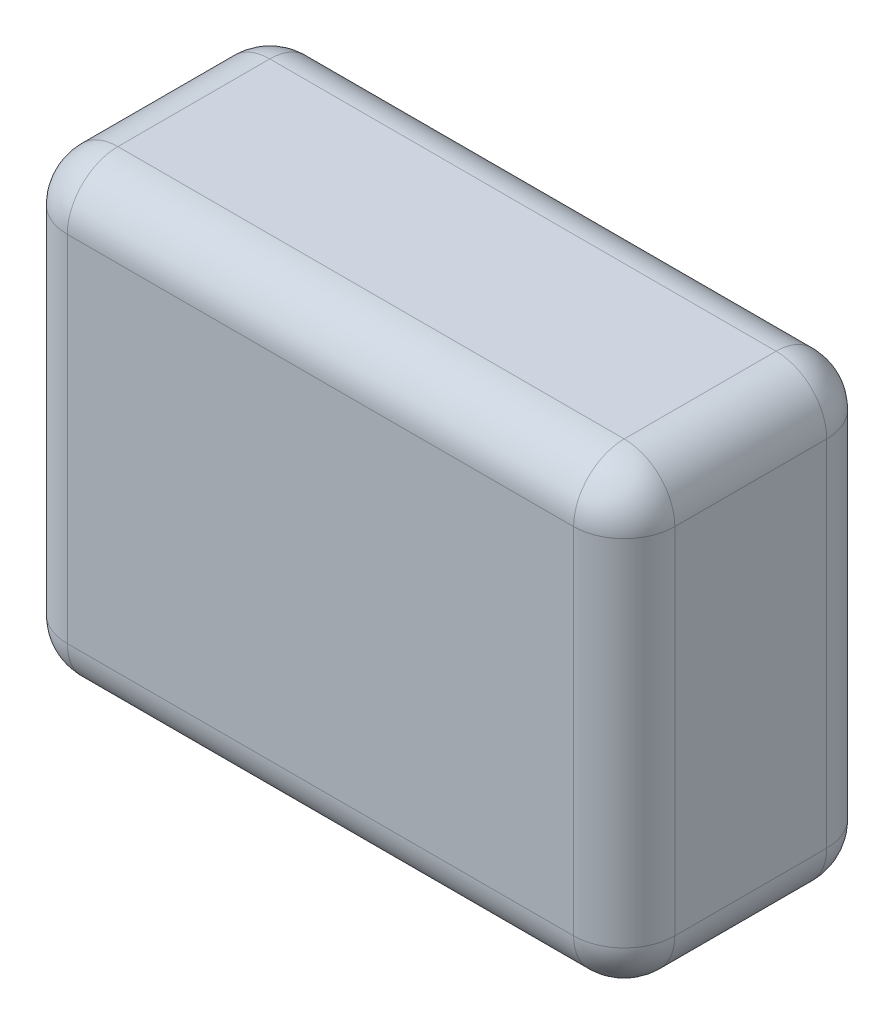
ISO-10303-21;
HEADER;
FILE_DESCRIPTION(('STEP AP214'),'2;1');
FILE_NAME('part.step','',(''),(''),'','','');
FILE_SCHEMA(('AUTOMOTIVE_DESIGN { 1 0 10303 214 1 1 1 1 }'));
ENDSEC;
DATA;
#1=APPLICATION_CONTEXT('core data for automotive mechanical design processes');
#2=APPLICATION_PROTOCOL_DEFINITION('international standard','automotive_design',2000,#1);
#3=PRODUCT_CONTEXT('',#1,'mechanical');
#4=PRODUCT('Part','Part','',(#3));
#5=PRODUCT_RELATED_PRODUCT_CATEGORY('part','',(#4));
#6=PRODUCT_DEFINITION_FORMATION('','',#4);
#7=PRODUCT_DEFINITION_CONTEXT('part definition',#1,'design');
#8=PRODUCT_DEFINITION('design','',#6,#7);
#9=PRODUCT_DEFINITION_SHAPE('','',#8);
#10=(LENGTH_UNIT() NAMED_UNIT(*) SI_UNIT(.MILLI.,.METRE.));
#11=(NAMED_UNIT(*) PLANE_ANGLE_UNIT() SI_UNIT($,.RADIAN.));
#12=(NAMED_UNIT(*) SI_UNIT($,.STERADIAN.) SOLID_ANGLE_UNIT());
#13=UNCERTAINTY_MEASURE_WITH_UNIT(LENGTH_MEASURE(1.E-05),#10,'distance_accuracy_value','');
#14=(GEOMETRIC_REPRESENTATION_CONTEXT(3) GLOBAL_UNCERTAINTY_ASSIGNED_CONTEXT((#13)) GLOBAL_UNIT_ASSIGNED_CONTEXT((#10,
#11,#12)) REPRESENTATION_CONTEXT('',''));
#15=CARTESIAN_POINT('',(0.,0.,0.));
#16=DIRECTION('',(0.,0.,1.));
#17=DIRECTION('',(1.,0.,0.));
#18=AXIS2_PLACEMENT_3D('',#15,#16,#17);
#19=CARTESIAN_POINT('',(60.,45.,50.));
#20=DIRECTION('',(-1.,0.,0.));
#21=DIRECTION('',(0.,-1.,0.));
#22=AXIS2_PLACEMENT_3D('',#19,#20,#21);
#23=PLANE('',#22);
#24=DIRECTION('',(0.,0.,-1.));
#25=VECTOR('',#24,1.);
#26=CARTESIAN_POINT('',(60.,35.,50.));
#27=LINE('',#26,#25);
#28=CARTESIAN_POINT('',(60.,35.,10.));
#29=VERTEX_POINT('',#28);
#30=CARTESIAN_POINT('',(60.,35.,40.));
#31=VERTEX_POINT('',#30);
#32=EDGE_CURVE('E129',#29,#31,#27,.F.);
#33=ORIENTED_EDGE('',*,*,#32,.T.);
#34=DIRECTION('',(0.,1.,0.));
#35=VECTOR('',#34,1.);
#36=CARTESIAN_POINT('',(60.,-45.,40.));
#37=LINE('',#36,#35);
#38=CARTESIAN_POINT('',(60.,-35.,40.));
#39=VERTEX_POINT('',#38);
#40=EDGE_CURVE('E166',#31,#39,#37,.F.);
#41=ORIENTED_EDGE('',*,*,#40,.T.);
#42=DIRECTION('',(0.,0.,-1.));
#43=VECTOR('',#42,1.);
#44=CARTESIAN_POINT('',(60.,-35.,50.));
#45=LINE('',#44,#43);
#46=CARTESIAN_POINT('',(60.,-35.,10.));
#47=VERTEX_POINT('',#46);
#48=EDGE_CURVE('E163',#39,#47,#45,.T.);
#49=ORIENTED_EDGE('',*,*,#48,.T.);
#50=DIRECTION('',(0.,1.,0.));
#51=VECTOR('',#50,1.);
#52=CARTESIAN_POINT('',(60.,45.,10.));
#53=LINE('',#52,#51);
#54=EDGE_CURVE('E158',#47,#29,#53,.T.);
#55=ORIENTED_EDGE('',*,*,#54,.T.);
#56=EDGE_LOOP('',(#33,#41,#49,#55));
#57=FACE_BOUND('',#56,.T.);
#58=ADVANCED_FACE('F33',(#57),#23,.F.);
#59=CARTESIAN_POINT('',(-60.,45.,50.));
#60=DIRECTION('',(0.,-1.,0.));
#61=DIRECTION('',(0.,0.,-1.));
#62=AXIS2_PLACEMENT_3D('',#59,#60,#61);
#63=PLANE('',#62);
#64=DIRECTION('',(0.,0.,-1.));
#65=VECTOR('',#64,1.);
#66=CARTESIAN_POINT('',(-50.,45.,50.));
#67=LINE('',#66,#65);
#68=CARTESIAN_POINT('',(-50.,45.,10.));
#69=VERTEX_POINT('',#68);
#70=CARTESIAN_POINT('',(-50.,45.,40.));
#71=VERTEX_POINT('',#70);
#72=EDGE_CURVE('E151',#69,#71,#67,.F.);
#73=ORIENTED_EDGE('',*,*,#72,.T.);
#74=DIRECTION('',(-1.,0.,0.));
#75=VECTOR('',#74,1.);
#76=CARTESIAN_POINT('',(60.,45.,40.));
#77=LINE('',#76,#75);
#78=CARTESIAN_POINT('',(50.,45.,40.));
#79=VERTEX_POINT('',#78);
#80=EDGE_CURVE('E155',#71,#79,#77,.F.);
#81=ORIENTED_EDGE('',*,*,#80,.T.);
#82=DIRECTION('',(0.,0.,-1.));
#83=VECTOR('',#82,1.);
#84=CARTESIAN_POINT('',(50.,45.,50.));
#85=LINE('',#84,#83);
#86=CARTESIAN_POINT('',(50.,45.,10.));
#87=VERTEX_POINT('',#86);
#88=EDGE_CURVE('E127',#79,#87,#85,.T.);
#89=ORIENTED_EDGE('',*,*,#88,.T.);
#90=DIRECTION('',(-1.,0.,0.));
#91=VECTOR('',#90,1.);
#92=CARTESIAN_POINT('',(-60.,45.,10.));
#93=LINE('',#92,#91);
#94=EDGE_CURVE('E145',#87,#69,#93,.T.);
#95=ORIENTED_EDGE('',*,*,#94,.T.);
#96=EDGE_LOOP('',(#73,#81,#89,#95));
#97=FACE_BOUND('',#96,.T.);
#98=ADVANCED_FACE('F153',(#97),#63,.F.);
#99=CARTESIAN_POINT('',(-60.,45.,50.));
#100=DIRECTION('',(1.,0.,0.));
#101=DIRECTION('',(0.,1.,0.));
#102=AXIS2_PLACEMENT_3D('',#99,#100,#101);
#103=PLANE('',#102);
#104=DIRECTION('',(0.,0.,-1.));
#105=VECTOR('',#104,1.);
#106=CARTESIAN_POINT('',(-60.,-35.,50.));
#107=LINE('',#106,#105);
#108=CARTESIAN_POINT('',(-60.,-35.,10.));
#109=VERTEX_POINT('',#108);
#110=CARTESIAN_POINT('',(-60.,-35.,40.));
#111=VERTEX_POINT('',#110);
#112=EDGE_CURVE('E170',#109,#111,#107,.F.);
#113=ORIENTED_EDGE('',*,*,#112,.T.);
#114=DIRECTION('',(0.,-1.,0.));
#115=VECTOR('',#114,1.);
#116=CARTESIAN_POINT('',(-60.,45.,40.));
#117=LINE('',#116,#115);
#118=CARTESIAN_POINT('',(-60.,35.,40.));
#119=VERTEX_POINT('',#118);
#120=EDGE_CURVE('E175',#111,#119,#117,.F.);
#121=ORIENTED_EDGE('',*,*,#120,.T.);
#122=DIRECTION('',(0.,0.,-1.));
#123=VECTOR('',#122,1.);
#124=CARTESIAN_POINT('',(-60.,35.,50.));
#125=LINE('',#124,#123);
#126=CARTESIAN_POINT('',(-60.,35.,10.));
#127=VERTEX_POINT('',#126);
#128=EDGE_CURVE('E172',#119,#127,#125,.T.);
#129=ORIENTED_EDGE('',*,*,#128,.T.);
#130=DIRECTION('',(0.,-1.,0.));
#131=VECTOR('',#130,1.);
#132=CARTESIAN_POINT('',(-60.,45.,10.));
#133=LINE('',#132,#131);
#134=EDGE_CURVE('E168',#127,#109,#133,.T.);
#135=ORIENTED_EDGE('',*,*,#134,.T.);
#136=EDGE_LOOP('',(#113,#121,#129,#135));
#137=FACE_BOUND('',#136,.T.);
#138=ADVANCED_FACE('F280',(#137),#103,.F.);
#139=CARTESIAN_POINT('',(-60.,-45.,50.));
#140=DIRECTION('',(0.,1.,0.));
#141=DIRECTION('',(0.,0.,1.));
#142=AXIS2_PLACEMENT_3D('',#139,#140,#141);
#143=PLANE('',#142);
#144=DIRECTION('',(0.,0.,-1.));
#145=VECTOR('',#144,1.);
#146=CARTESIAN_POINT('',(50.,-45.,50.));
#147=LINE('',#146,#145);
#148=CARTESIAN_POINT('',(50.,-45.,10.));
#149=VERTEX_POINT('',#148);
#150=CARTESIAN_POINT('',(50.,-45.,40.));
#151=VERTEX_POINT('',#150);
#152=EDGE_CURVE('E179',#149,#151,#147,.F.);
#153=ORIENTED_EDGE('',*,*,#152,.T.);
#154=DIRECTION('',(1.,0.,0.));
#155=VECTOR('',#154,1.);
#156=CARTESIAN_POINT('',(-60.,-45.,40.));
#157=LINE('',#156,#155);
#158=CARTESIAN_POINT('',(-50.,-45.,40.));
#159=VERTEX_POINT('',#158);
#160=EDGE_CURVE('E184',#151,#159,#157,.F.);
#161=ORIENTED_EDGE('',*,*,#160,.T.);
#162=DIRECTION('',(0.,0.,-1.));
#163=VECTOR('',#162,1.);
#164=CARTESIAN_POINT('',(-50.,-45.,50.));
#165=LINE('',#164,#163);
#166=CARTESIAN_POINT('',(-50.,-45.,10.));
#167=VERTEX_POINT('',#166);
#168=EDGE_CURVE('E181',#159,#167,#165,.T.);
#169=ORIENTED_EDGE('',*,*,#168,.T.);
#170=DIRECTION('',(1.,0.,0.));
#171=VECTOR('',#170,1.);
#172=CARTESIAN_POINT('',(-60.,-45.,10.));
#173=LINE('',#172,#171);
#174=EDGE_CURVE('E177',#167,#149,#173,.T.);
#175=ORIENTED_EDGE('',*,*,#174,.T.);
#176=EDGE_LOOP('',(#153,#161,#169,#175));
#177=FACE_BOUND('',#176,.T.);
#178=ADVANCED_FACE('F291',(#177),#143,.F.);
#179=CARTESIAN_POINT('',(60.,-45.,50.));
#180=DIRECTION('',(0.,0.,1.));
#181=DIRECTION('',(1.,0.,0.));
#182=AXIS2_PLACEMENT_3D('',#179,#180,#181);
#183=PLANE('',#182);
#184=DIRECTION('',(0.,-1.,0.));
#185=VECTOR('',#184,1.);
#186=CARTESIAN_POINT('',(-50.,-45.,50.));
#187=LINE('',#186,#185);
#188=CARTESIAN_POINT('',(-50.,35.,50.));
#189=VERTEX_POINT('',#188);
#190=CARTESIAN_POINT('',(-50.,-35.,50.));
#191=VERTEX_POINT('',#190);
#192=EDGE_CURVE('E190',#189,#191,#187,.T.);
#193=ORIENTED_EDGE('',*,*,#192,.T.);
#194=DIRECTION('',(1.,0.,0.));
#195=VECTOR('',#194,1.);
#196=CARTESIAN_POINT('',(60.,-35.,50.));
#197=LINE('',#196,#195);
#198=CARTESIAN_POINT('',(50.,-35.,50.));
#199=VERTEX_POINT('',#198);
#200=EDGE_CURVE('E192',#191,#199,#197,.T.);
#201=ORIENTED_EDGE('',*,*,#200,.T.);
#202=DIRECTION('',(0.,1.,0.));
#203=VECTOR('',#202,1.);
#204=CARTESIAN_POINT('',(50.,45.,50.));
#205=LINE('',#204,#203);
#206=CARTESIAN_POINT('',(50.,35.,50.));
#207=VERTEX_POINT('',#206);
#208=EDGE_CURVE('E186',#199,#207,#205,.T.);
#209=ORIENTED_EDGE('',*,*,#208,.T.);
#210=DIRECTION('',(-1.,0.,0.));
#211=VECTOR('',#210,1.);
#212=CARTESIAN_POINT('',(-60.,35.,50.));
#213=LINE('',#212,#211);
#214=EDGE_CURVE('E188',#207,#189,#213,.T.);
#215=ORIENTED_EDGE('',*,*,#214,.T.);
#216=EDGE_LOOP('',(#193,#201,#209,#215));
#217=FACE_BOUND('',#216,.T.);
#218=ADVANCED_FACE('F272',(#217),#183,.T.);
#219=CARTESIAN_POINT('',(60.,-45.,0.));
#220=DIRECTION('',(0.,0.,1.));
#221=DIRECTION('',(1.,0.,0.));
#222=AXIS2_PLACEMENT_3D('',#219,#220,#221);
#223=PLANE('',#222);
#224=DIRECTION('',(0.,-1.,0.));
#225=VECTOR('',#224,1.);
#226=CARTESIAN_POINT('',(-50.,-45.,0.));
#227=LINE('',#226,#225);
#228=CARTESIAN_POINT('',(-50.,-35.,0.));
#229=VERTEX_POINT('',#228);
#230=CARTESIAN_POINT('',(-50.,35.,0.));
#231=VERTEX_POINT('',#230);
#232=EDGE_CURVE('E42',#229,#231,#227,.F.);
#233=ORIENTED_EDGE('',*,*,#232,.T.);
#234=DIRECTION('',(-1.,0.,0.));
#235=VECTOR('',#234,1.);
#236=CARTESIAN_POINT('',(60.,35.,0.));
#237=LINE('',#236,#235);
#238=CARTESIAN_POINT('',(50.,35.,0.));
#239=VERTEX_POINT('',#238);
#240=EDGE_CURVE('E11',#231,#239,#237,.F.);
#241=ORIENTED_EDGE('',*,*,#240,.T.);
#242=DIRECTION('',(0.,1.,0.));
#243=VECTOR('',#242,1.);
#244=CARTESIAN_POINT('',(50.,-45.,0.));
#245=LINE('',#244,#243);
#246=CARTESIAN_POINT('',(50.,-35.,0.));
#247=VERTEX_POINT('',#246);
#248=EDGE_CURVE('E195',#239,#247,#245,.F.);
#249=ORIENTED_EDGE('',*,*,#248,.T.);
#250=DIRECTION('',(1.,0.,0.));
#251=VECTOR('',#250,1.);
#252=CARTESIAN_POINT('',(60.,-35.,0.));
#253=LINE('',#252,#251);
#254=EDGE_CURVE('E53',#247,#229,#253,.F.);
#255=ORIENTED_EDGE('',*,*,#254,.T.);
#256=EDGE_LOOP('',(#233,#241,#249,#255));
#257=FACE_BOUND('',#256,.T.);
#258=ADVANCED_FACE('F478',(#257),#223,.F.);
#259=CARTESIAN_POINT('',(-50.,-35.,50.));
#260=DIRECTION('',(0.,0.,-1.));
#261=DIRECTION('',(-1.,0.,0.));
#262=AXIS2_PLACEMENT_3D('',#259,#260,#261);
#263=CYLINDRICAL_SURFACE('',#262,10.);
#264=CARTESIAN_POINT('',(-50.,-35.,40.));
#265=DIRECTION('',(0.,0.,1.));
#266=DIRECTION('',(1.,0.,0.));
#267=AXIS2_PLACEMENT_3D('',#264,#265,#266);
#268=CIRCLE('',#267,10.);
#269=EDGE_CURVE('E37',#111,#159,#268,.T.);
#270=ORIENTED_EDGE('',*,*,#269,.F.);
#271=ORIENTED_EDGE('',*,*,#112,.F.);
#272=CARTESIAN_POINT('',(-50.,-35.,10.));
#273=DIRECTION('',(0.,0.,-1.));
#274=DIRECTION('',(-1.,0.,0.));
#275=AXIS2_PLACEMENT_3D('',#272,#273,#274);
#276=CIRCLE('',#275,10.);
#277=EDGE_CURVE('E249',#167,#109,#276,.T.);
#278=ORIENTED_EDGE('',*,*,#277,.F.);
#279=ORIENTED_EDGE('',*,*,#168,.F.);
#280=EDGE_LOOP('',(#270,#271,#278,#279));
#281=FACE_BOUND('',#280,.T.);
#282=ADVANCED_FACE('F35',(#281),#263,.T.);
#283=CARTESIAN_POINT('',(-50.,-35.,40.));
#284=DIRECTION('',(0.,0.,1.));
#285=DIRECTION('',(1.,0.,0.));
#286=AXIS2_PLACEMENT_3D('',#283,#284,#285);
#287=SPHERICAL_SURFACE('',#286,10.);
#288=CARTESIAN_POINT('',(-50.,-35.,40.));
#289=DIRECTION('',(0.,-1.,0.));
#290=DIRECTION('',(0.,0.,-1.));
#291=AXIS2_PLACEMENT_3D('',#288,#289,#290);
#292=CIRCLE('',#291,10.);
#293=EDGE_CURVE('E244',#111,#191,#292,.F.);
#294=ORIENTED_EDGE('',*,*,#293,.F.);
#295=ORIENTED_EDGE('',*,*,#269,.T.);
#296=CARTESIAN_POINT('',(-50.,-35.,40.));
#297=DIRECTION('',(-1.,0.,0.));
#298=DIRECTION('',(0.,0.,1.));
#299=AXIS2_PLACEMENT_3D('',#296,#297,#298);
#300=CIRCLE('',#299,10.);
#301=EDGE_CURVE('E247',#191,#159,#300,.F.);
#302=ORIENTED_EDGE('',*,*,#301,.F.);
#303=EDGE_LOOP('',(#294,#295,#302));
#304=FACE_BOUND('',#303,.T.);
#305=ADVANCED_FACE('F260',(#304),#287,.T.);
#306=CARTESIAN_POINT('',(-50.,-35.,10.));
#307=DIRECTION('',(0.,0.,1.));
#308=DIRECTION('',(1.,0.,0.));
#309=AXIS2_PLACEMENT_3D('',#306,#307,#308);
#310=SPHERICAL_SURFACE('',#309,10.);
#311=CARTESIAN_POINT('',(-50.,-35.,10.));
#312=DIRECTION('',(-1.,0.,0.));
#313=DIRECTION('',(0.,0.,1.));
#314=AXIS2_PLACEMENT_3D('',#311,#312,#313);
#315=CIRCLE('',#314,10.);
#316=EDGE_CURVE('E239',#167,#229,#315,.F.);
#317=ORIENTED_EDGE('',*,*,#316,.F.);
#318=ORIENTED_EDGE('',*,*,#277,.T.);
#319=CARTESIAN_POINT('',(-50.,-35.,10.));
#320=DIRECTION('',(0.,-1.,0.));
#321=DIRECTION('',(0.,0.,-1.));
#322=AXIS2_PLACEMENT_3D('',#319,#320,#321);
#323=CIRCLE('',#322,10.);
#324=EDGE_CURVE('E241',#229,#109,#323,.F.);
#325=ORIENTED_EDGE('',*,*,#324,.F.);
#326=EDGE_LOOP('',(#317,#318,#325));
#327=FACE_BOUND('',#326,.T.);
#328=ADVANCED_FACE('F457',(#327),#310,.T.);
#329=CARTESIAN_POINT('',(60.,-35.,40.));
#330=DIRECTION('',(-1.,0.,0.));
#331=DIRECTION('',(0.,0.,1.));
#332=AXIS2_PLACEMENT_3D('',#329,#330,#331);
#333=CYLINDRICAL_SURFACE('',#332,10.);
#334=ORIENTED_EDGE('',*,*,#301,.T.);
#335=ORIENTED_EDGE('',*,*,#160,.F.);
#336=CARTESIAN_POINT('',(50.,-35.,40.));
#337=DIRECTION('',(1.,0.,0.));
#338=DIRECTION('',(0.,0.,-1.));
#339=AXIS2_PLACEMENT_3D('',#336,#337,#338);
#340=CIRCLE('',#339,10.);
#341=EDGE_CURVE('E233',#199,#151,#340,.T.);
#342=ORIENTED_EDGE('',*,*,#341,.F.);
#343=ORIENTED_EDGE('',*,*,#200,.F.);
#344=EDGE_LOOP('',(#334,#335,#342,#343));
#345=FACE_BOUND('',#344,.T.);
#346=ADVANCED_FACE('F268',(#345),#333,.T.);
#347=CARTESIAN_POINT('',(-50.,-45.,40.));
#348=DIRECTION('',(0.,1.,0.));
#349=DIRECTION('',(-1.,0.,0.));
#350=AXIS2_PLACEMENT_3D('',#347,#348,#349);
#351=CYLINDRICAL_SURFACE('',#350,10.);
#352=ORIENTED_EDGE('',*,*,#293,.T.);
#353=ORIENTED_EDGE('',*,*,#192,.F.);
#354=CARTESIAN_POINT('',(-50.,35.,40.));
#355=DIRECTION('',(0.,1.,0.));
#356=DIRECTION('',(0.,0.,1.));
#357=AXIS2_PLACEMENT_3D('',#354,#355,#356);
#358=CIRCLE('',#357,10.);
#359=EDGE_CURVE('E230',#119,#189,#358,.T.);
#360=ORIENTED_EDGE('',*,*,#359,.F.);
#361=ORIENTED_EDGE('',*,*,#120,.F.);
#362=EDGE_LOOP('',(#352,#353,#360,#361));
#363=FACE_BOUND('',#362,.T.);
#364=ADVANCED_FACE('F277',(#363),#351,.T.);
#365=CARTESIAN_POINT('',(-50.,35.,50.));
#366=DIRECTION('',(0.,0.,-1.));
#367=DIRECTION('',(-1.,0.,0.));
#368=AXIS2_PLACEMENT_3D('',#365,#366,#367);
#369=CYLINDRICAL_SURFACE('',#368,10.);
#370=CARTESIAN_POINT('',(-50.,35.,10.));
#371=DIRECTION('',(0.,0.,-1.));
#372=DIRECTION('',(-1.,0.,0.));
#373=AXIS2_PLACEMENT_3D('',#370,#371,#372);
#374=CIRCLE('',#373,10.);
#375=EDGE_CURVE('E224',#127,#69,#374,.T.);
#376=ORIENTED_EDGE('',*,*,#375,.F.);
#377=ORIENTED_EDGE('',*,*,#128,.F.);
#378=CARTESIAN_POINT('',(-50.,35.,40.));
#379=DIRECTION('',(0.,0.,1.));
#380=DIRECTION('',(1.,0.,0.));
#381=AXIS2_PLACEMENT_3D('',#378,#379,#380);
#382=CIRCLE('',#381,10.);
#383=EDGE_CURVE('E227',#71,#119,#382,.T.);
#384=ORIENTED_EDGE('',*,*,#383,.F.);
#385=ORIENTED_EDGE('',*,*,#72,.F.);
#386=EDGE_LOOP('',(#376,#377,#384,#385));
#387=FACE_BOUND('',#386,.T.);
#388=ADVANCED_FACE('F284',(#387),#369,.T.);
#389=CARTESIAN_POINT('',(-50.,45.,10.));
#390=DIRECTION('',(0.,-1.,0.));
#391=DIRECTION('',(1.,0.,0.));
#392=AXIS2_PLACEMENT_3D('',#389,#390,#391);
#393=CYLINDRICAL_SURFACE('',#392,10.);
#394=ORIENTED_EDGE('',*,*,#324,.T.);
#395=ORIENTED_EDGE('',*,*,#134,.F.);
#396=CARTESIAN_POINT('',(-50.,35.,10.));
#397=DIRECTION('',(0.,1.,0.));
#398=DIRECTION('',(0.,0.,1.));
#399=AXIS2_PLACEMENT_3D('',#396,#397,#398);
#400=CIRCLE('',#399,10.);
#401=EDGE_CURVE('E222',#231,#127,#400,.T.);
#402=ORIENTED_EDGE('',*,*,#401,.F.);
#403=ORIENTED_EDGE('',*,*,#232,.F.);
#404=EDGE_LOOP('',(#394,#395,#402,#403));
#405=FACE_BOUND('',#404,.T.);
#406=ADVANCED_FACE('F289',(#405),#393,.T.);
#407=CARTESIAN_POINT('',(-60.,-35.,10.));
#408=DIRECTION('',(1.,0.,0.));
#409=DIRECTION('',(0.,0.,-1.));
#410=AXIS2_PLACEMENT_3D('',#407,#408,#409);
#411=CYLINDRICAL_SURFACE('',#410,10.);
#412=ORIENTED_EDGE('',*,*,#316,.T.);
#413=ORIENTED_EDGE('',*,*,#254,.F.);
#414=CARTESIAN_POINT('',(50.,-35.,10.));
#415=DIRECTION('',(1.,0.,0.));
#416=DIRECTION('',(0.,0.,-1.));
#417=AXIS2_PLACEMENT_3D('',#414,#415,#416);
#418=CIRCLE('',#417,10.);
#419=EDGE_CURVE('E219',#149,#247,#418,.T.);
#420=ORIENTED_EDGE('',*,*,#419,.F.);
#421=ORIENTED_EDGE('',*,*,#174,.F.);
#422=EDGE_LOOP('',(#412,#413,#420,#421));
#423=FACE_BOUND('',#422,.T.);
#424=ADVANCED_FACE('F300',(#423),#411,.T.);
#425=CARTESIAN_POINT('',(50.,-35.,50.));
#426=DIRECTION('',(0.,0.,-1.));
#427=DIRECTION('',(-1.,0.,0.));
#428=AXIS2_PLACEMENT_3D('',#425,#426,#427);
#429=CYLINDRICAL_SURFACE('',#428,10.);
#430=CARTESIAN_POINT('',(50.,-35.,40.));
#431=DIRECTION('',(0.,0.,1.));
#432=DIRECTION('',(1.,0.,0.));
#433=AXIS2_PLACEMENT_3D('',#430,#431,#432);
#434=CIRCLE('',#433,10.);
#435=EDGE_CURVE('E236',#151,#39,#434,.T.);
#436=ORIENTED_EDGE('',*,*,#435,.F.);
#437=ORIENTED_EDGE('',*,*,#152,.F.);
#438=CARTESIAN_POINT('',(50.,-35.,10.));
#439=DIRECTION('',(0.,0.,-1.));
#440=DIRECTION('',(-1.,0.,0.));
#441=AXIS2_PLACEMENT_3D('',#438,#439,#440);
#442=CIRCLE('',#441,10.);
#443=EDGE_CURVE('E216',#47,#149,#442,.T.);
#444=ORIENTED_EDGE('',*,*,#443,.F.);
#445=ORIENTED_EDGE('',*,*,#48,.F.);
#446=EDGE_LOOP('',(#436,#437,#444,#445));
#447=FACE_BOUND('',#446,.T.);
#448=ADVANCED_FACE('F296',(#447),#429,.T.);
#449=CARTESIAN_POINT('',(50.,-35.,40.));
#450=DIRECTION('',(0.,0.,1.));
#451=DIRECTION('',(1.,0.,0.));
#452=AXIS2_PLACEMENT_3D('',#449,#450,#451);
#453=SPHERICAL_SURFACE('',#452,10.);
#454=ORIENTED_EDGE('',*,*,#341,.T.);
#455=ORIENTED_EDGE('',*,*,#435,.T.);
#456=CARTESIAN_POINT('',(50.,-35.,40.));
#457=DIRECTION('',(0.,-1.,0.));
#458=DIRECTION('',(0.,0.,-1.));
#459=AXIS2_PLACEMENT_3D('',#456,#457,#458);
#460=CIRCLE('',#459,10.);
#461=EDGE_CURVE('E213',#199,#39,#460,.F.);
#462=ORIENTED_EDGE('',*,*,#461,.F.);
#463=EDGE_LOOP('',(#454,#455,#462));
#464=FACE_BOUND('',#463,.T.);
#465=ADVANCED_FACE('F310',(#464),#453,.T.);
#466=CARTESIAN_POINT('',(-50.,35.,40.));
#467=DIRECTION('',(0.,0.,1.));
#468=DIRECTION('',(1.,0.,0.));
#469=AXIS2_PLACEMENT_3D('',#466,#467,#468);
#470=SPHERICAL_SURFACE('',#469,10.);
#471=ORIENTED_EDGE('',*,*,#383,.T.);
#472=ORIENTED_EDGE('',*,*,#359,.T.);
#473=CARTESIAN_POINT('',(-50.,35.,40.));
#474=DIRECTION('',(-1.,0.,0.));
#475=DIRECTION('',(0.,-1.,0.));
#476=AXIS2_PLACEMENT_3D('',#473,#474,#475);
#477=CIRCLE('',#476,10.);
#478=EDGE_CURVE('E210',#71,#189,#477,.F.);
#479=ORIENTED_EDGE('',*,*,#478,.F.);
#480=EDGE_LOOP('',(#471,#472,#479));
#481=FACE_BOUND('',#480,.T.);
#482=ADVANCED_FACE('F320',(#481),#470,.T.);
#483=CARTESIAN_POINT('',(-50.,35.,10.));
#484=DIRECTION('',(0.,0.,1.));
#485=DIRECTION('',(1.,0.,0.));
#486=AXIS2_PLACEMENT_3D('',#483,#484,#485);
#487=SPHERICAL_SURFACE('',#486,10.);
#488=ORIENTED_EDGE('',*,*,#401,.T.);
#489=ORIENTED_EDGE('',*,*,#375,.T.);
#490=CARTESIAN_POINT('',(-50.,35.,10.));
#491=DIRECTION('',(-1.,0.,0.));
#492=DIRECTION('',(0.,0.,1.));
#493=AXIS2_PLACEMENT_3D('',#490,#491,#492);
#494=CIRCLE('',#493,10.);
#495=EDGE_CURVE('E148',#231,#69,#494,.F.);
#496=ORIENTED_EDGE('',*,*,#495,.F.);
#497=EDGE_LOOP('',(#488,#489,#496));
#498=FACE_BOUND('',#497,.T.);
#499=ADVANCED_FACE('F322',(#498),#487,.T.);
#500=CARTESIAN_POINT('',(50.,-35.,10.));
#501=DIRECTION('',(0.,0.,1.));
#502=DIRECTION('',(1.,0.,0.));
#503=AXIS2_PLACEMENT_3D('',#500,#501,#502);
#504=SPHERICAL_SURFACE('',#503,10.);
#505=ORIENTED_EDGE('',*,*,#443,.T.);
#506=ORIENTED_EDGE('',*,*,#419,.T.);
#507=CARTESIAN_POINT('',(50.,-35.,10.));
#508=DIRECTION('',(0.,-1.,0.));
#509=DIRECTION('',(1.,0.,0.));
#510=AXIS2_PLACEMENT_3D('',#507,#508,#509);
#511=CIRCLE('',#510,10.);
#512=EDGE_CURVE('E206',#47,#247,#511,.F.);
#513=ORIENTED_EDGE('',*,*,#512,.F.);
#514=EDGE_LOOP('',(#505,#506,#513));
#515=FACE_BOUND('',#514,.T.);
#516=ADVANCED_FACE('F302',(#515),#504,.T.);
#517=CARTESIAN_POINT('',(50.,-45.,40.));
#518=DIRECTION('',(0.,-1.,0.));
#519=DIRECTION('',(1.,0.,0.));
#520=AXIS2_PLACEMENT_3D('',#517,#518,#519);
#521=CYLINDRICAL_SURFACE('',#520,10.);
#522=ORIENTED_EDGE('',*,*,#461,.T.);
#523=ORIENTED_EDGE('',*,*,#40,.F.);
#524=CARTESIAN_POINT('',(50.,35.,40.));
#525=DIRECTION('',(0.,1.,0.));
#526=DIRECTION('',(-1.,0.,0.));
#527=AXIS2_PLACEMENT_3D('',#524,#525,#526);
#528=CIRCLE('',#527,10.);
#529=EDGE_CURVE('E203',#207,#31,#528,.T.);
#530=ORIENTED_EDGE('',*,*,#529,.F.);
#531=ORIENTED_EDGE('',*,*,#208,.F.);
#532=EDGE_LOOP('',(#522,#523,#530,#531));
#533=FACE_BOUND('',#532,.T.);
#534=ADVANCED_FACE('F312',(#533),#521,.T.);
#535=CARTESIAN_POINT('',(60.,35.,40.));
#536=DIRECTION('',(1.,0.,0.));
#537=DIRECTION('',(0.,0.,-1.));
#538=AXIS2_PLACEMENT_3D('',#535,#536,#537);
#539=CYLINDRICAL_SURFACE('',#538,10.);
#540=ORIENTED_EDGE('',*,*,#478,.T.);
#541=ORIENTED_EDGE('',*,*,#214,.F.);
#542=CARTESIAN_POINT('',(50.,35.,40.));
#543=DIRECTION('',(1.,0.,0.));
#544=DIRECTION('',(0.,0.,-1.));
#545=AXIS2_PLACEMENT_3D('',#542,#543,#544);
#546=CIRCLE('',#545,10.);
#547=EDGE_CURVE('E142',#79,#207,#546,.T.);
#548=ORIENTED_EDGE('',*,*,#547,.F.);
#549=ORIENTED_EDGE('',*,*,#80,.F.);
#550=EDGE_LOOP('',(#540,#541,#548,#549));
#551=FACE_BOUND('',#550,.T.);
#552=ADVANCED_FACE('F318',(#551),#539,.T.);
#553=CARTESIAN_POINT('',(-60.,35.,10.));
#554=DIRECTION('',(-1.,0.,0.));
#555=DIRECTION('',(0.,0.,1.));
#556=AXIS2_PLACEMENT_3D('',#553,#554,#555);
#557=CYLINDRICAL_SURFACE('',#556,10.);
#558=ORIENTED_EDGE('',*,*,#495,.T.);
#559=ORIENTED_EDGE('',*,*,#94,.F.);
#560=CARTESIAN_POINT('',(50.,35.,10.));
#561=DIRECTION('',(1.,0.,0.));
#562=DIRECTION('',(0.,1.,0.));
#563=AXIS2_PLACEMENT_3D('',#560,#561,#562);
#564=CIRCLE('',#563,10.);
#565=EDGE_CURVE('E134',#239,#87,#564,.T.);
#566=ORIENTED_EDGE('',*,*,#565,.F.);
#567=ORIENTED_EDGE('',*,*,#240,.F.);
#568=EDGE_LOOP('',(#558,#559,#566,#567));
#569=FACE_BOUND('',#568,.T.);
#570=ADVANCED_FACE('F146',(#569),#557,.T.);
#571=CARTESIAN_POINT('',(50.,45.,10.));
#572=DIRECTION('',(0.,1.,0.));
#573=DIRECTION('',(-1.,0.,0.));
#574=AXIS2_PLACEMENT_3D('',#571,#572,#573);
#575=CYLINDRICAL_SURFACE('',#574,10.);
#576=ORIENTED_EDGE('',*,*,#512,.T.);
#577=ORIENTED_EDGE('',*,*,#248,.F.);
#578=CARTESIAN_POINT('',(50.,35.,10.));
#579=DIRECTION('',(0.,1.,0.));
#580=DIRECTION('',(0.,0.,1.));
#581=AXIS2_PLACEMENT_3D('',#578,#579,#580);
#582=CIRCLE('',#581,10.);
#583=EDGE_CURVE('E138',#29,#239,#582,.T.);
#584=ORIENTED_EDGE('',*,*,#583,.F.);
#585=ORIENTED_EDGE('',*,*,#54,.F.);
#586=EDGE_LOOP('',(#576,#577,#584,#585));
#587=FACE_BOUND('',#586,.T.);
#588=ADVANCED_FACE('F305',(#587),#575,.T.);
#589=CARTESIAN_POINT('',(50.,35.,40.));
#590=DIRECTION('',(0.,0.,1.));
#591=DIRECTION('',(1.,0.,0.));
#592=AXIS2_PLACEMENT_3D('',#589,#590,#591);
#593=SPHERICAL_SURFACE('',#592,10.);
#594=ORIENTED_EDGE('',*,*,#547,.T.);
#595=ORIENTED_EDGE('',*,*,#529,.T.);
#596=CARTESIAN_POINT('',(50.,35.,40.));
#597=DIRECTION('',(0.,0.,1.));
#598=DIRECTION('',(1.,0.,0.));
#599=AXIS2_PLACEMENT_3D('',#596,#597,#598);
#600=CIRCLE('',#599,10.);
#601=EDGE_CURVE('E131',#79,#31,#600,.F.);
#602=ORIENTED_EDGE('',*,*,#601,.F.);
#603=EDGE_LOOP('',(#594,#595,#602));
#604=FACE_BOUND('',#603,.T.);
#605=ADVANCED_FACE('F316',(#604),#593,.T.);
#606=CARTESIAN_POINT('',(50.,35.,10.));
#607=DIRECTION('',(0.,0.,1.));
#608=DIRECTION('',(1.,0.,0.));
#609=AXIS2_PLACEMENT_3D('',#606,#607,#608);
#610=SPHERICAL_SURFACE('',#609,10.);
#611=ORIENTED_EDGE('',*,*,#583,.T.);
#612=ORIENTED_EDGE('',*,*,#565,.T.);
#613=CARTESIAN_POINT('',(50.,35.,10.));
#614=DIRECTION('',(0.,0.,-1.));
#615=DIRECTION('',(-1.,0.,0.));
#616=AXIS2_PLACEMENT_3D('',#613,#614,#615);
#617=CIRCLE('',#616,10.);
#618=EDGE_CURVE('E123',#29,#87,#617,.F.);
#619=ORIENTED_EDGE('',*,*,#618,.F.);
#620=EDGE_LOOP('',(#611,#612,#619));
#621=FACE_BOUND('',#620,.T.);
#622=ADVANCED_FACE('F136',(#621),#610,.T.);
#623=CARTESIAN_POINT('',(50.,35.,50.));
#624=DIRECTION('',(0.,0.,-1.));
#625=DIRECTION('',(-1.,0.,0.));
#626=AXIS2_PLACEMENT_3D('',#623,#624,#625);
#627=CYLINDRICAL_SURFACE('',#626,10.);
#628=ORIENTED_EDGE('',*,*,#601,.T.);
#629=ORIENTED_EDGE('',*,*,#32,.F.);
#630=ORIENTED_EDGE('',*,*,#618,.T.);
#631=ORIENTED_EDGE('',*,*,#88,.F.);
#632=EDGE_LOOP('',(#628,#629,#630,#631));
#633=FACE_BOUND('',#632,.T.);
#634=ADVANCED_FACE('F125',(#633),#627,.T.);
#635=CLOSED_SHELL('',(#58,#98,#138,#178,#218,#258,#282,#305,#328,#346,#364,#388,#406,#424,#448,
#465,#482,#499,#516,#534,#552,#570,#588,#605,#622,#634));
#636=MANIFOLD_SOLID_BREP('B2',#635);
#637=ADVANCED_BREP_SHAPE_REPRESENTATION('',(#18,#636),#14);
#638=SHAPE_DEFINITION_REPRESENTATION(#9,#637);
ENDSEC;
END-ISO-10303-21;
